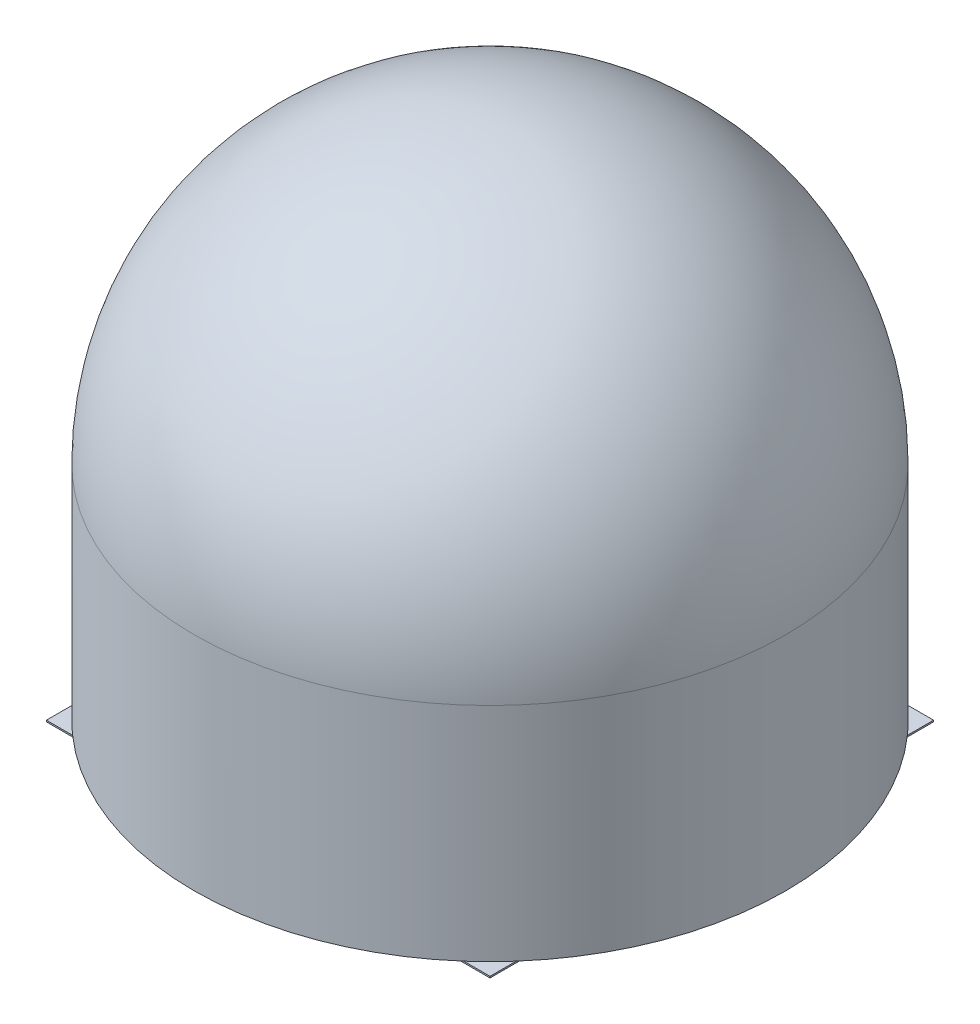
ISO-10303-21;
HEADER;
FILE_DESCRIPTION(('STEP AP214'),'2;1');
FILE_NAME('part.step','',(''),(''),'','','');
FILE_SCHEMA(('AUTOMOTIVE_DESIGN { 1 0 10303 214 1 1 1 1 }'));
ENDSEC;
DATA;
#1=APPLICATION_CONTEXT('core data for automotive mechanical design processes');
#2=APPLICATION_PROTOCOL_DEFINITION('international standard','automotive_design',2000,#1);
#3=PRODUCT_CONTEXT('',#1,'mechanical');
#4=PRODUCT('Part','Part','',(#3));
#5=PRODUCT_RELATED_PRODUCT_CATEGORY('part','',(#4));
#6=PRODUCT_DEFINITION_FORMATION('','',#4);
#7=PRODUCT_DEFINITION_CONTEXT('part definition',#1,'design');
#8=PRODUCT_DEFINITION('design','',#6,#7);
#9=PRODUCT_DEFINITION_SHAPE('','',#8);
#10=(LENGTH_UNIT() NAMED_UNIT(*) SI_UNIT(.MILLI.,.METRE.));
#11=(NAMED_UNIT(*) PLANE_ANGLE_UNIT() SI_UNIT($,.RADIAN.));
#12=(NAMED_UNIT(*) SI_UNIT($,.STERADIAN.) SOLID_ANGLE_UNIT());
#13=UNCERTAINTY_MEASURE_WITH_UNIT(LENGTH_MEASURE(1.E-05),#10,'distance_accuracy_value','');
#14=(GEOMETRIC_REPRESENTATION_CONTEXT(3) GLOBAL_UNCERTAINTY_ASSIGNED_CONTEXT((#13)) GLOBAL_UNIT_ASSIGNED_CONTEXT((#10,
#11,#12)) REPRESENTATION_CONTEXT('',''));
#15=CARTESIAN_POINT('',(0.,0.,0.));
#16=DIRECTION('',(0.,0.,1.));
#17=DIRECTION('',(1.,0.,0.));
#18=AXIS2_PLACEMENT_3D('',#15,#16,#17);
#19=CARTESIAN_POINT('',(0.,0.,0.));
#20=DIRECTION('',(0.,1.,0.));
#21=DIRECTION('',(0.,0.,1.));
#22=AXIS2_PLACEMENT_3D('',#19,#20,#21);
#23=PLANE('',#22);
#24=DIRECTION('',(0.,0.,1.));
#25=VECTOR('',#24,1.);
#26=CARTESIAN_POINT('',(150.,0.,150.));
#27=LINE('',#26,#25);
#28=CARTESIAN_POINT('',(150.,0.,-132.28756555323));
#29=VERTEX_POINT('',#28);
#30=CARTESIAN_POINT('',(150.,0.,132.28756555323));
#31=VERTEX_POINT('',#30);
#32=EDGE_CURVE('E11',#29,#31,#27,.T.);
#33=ORIENTED_EDGE('',*,*,#32,.F.);
#34=CARTESIAN_POINT('',(0.,0.,0.));
#35=DIRECTION('',(0.,1.,0.));
#36=DIRECTION('',(0.,0.,1.));
#37=AXIS2_PLACEMENT_3D('',#34,#35,#36);
#38=CIRCLE('',#37,200.);
#39=EDGE_CURVE('E148',#31,#29,#38,.T.);
#40=ORIENTED_EDGE('',*,*,#39,.F.);
#41=EDGE_LOOP('',(#33,#40));
#42=FACE_BOUND('',#41,.T.);
#43=ADVANCED_FACE('F39',(#42),#23,.F.);
#44=DIRECTION('',(1.,0.,0.));
#45=VECTOR('',#44,1.);
#46=CARTESIAN_POINT('',(-150.,0.,-150.));
#47=LINE('',#46,#45);
#48=CARTESIAN_POINT('',(-132.28756555323,0.,-150.));
#49=VERTEX_POINT('',#48);
#50=CARTESIAN_POINT('',(132.28756555323,0.,-150.));
#51=VERTEX_POINT('',#50);
#52=EDGE_CURVE('E49',#49,#51,#47,.T.);
#53=ORIENTED_EDGE('',*,*,#52,.F.);
#54=EDGE_CURVE('E160',#51,#49,#38,.T.);
#55=ORIENTED_EDGE('',*,*,#54,.F.);
#56=EDGE_LOOP('',(#53,#55));
#57=FACE_BOUND('',#56,.T.);
#58=ADVANCED_FACE('F223',(#57),#23,.F.);
#59=DIRECTION('',(0.,0.,-1.));
#60=VECTOR('',#59,1.);
#61=CARTESIAN_POINT('',(-150.,0.,150.));
#62=LINE('',#61,#60);
#63=CARTESIAN_POINT('',(-150.,0.,132.28756555323));
#64=VERTEX_POINT('',#63);
#65=CARTESIAN_POINT('',(-150.,0.,-132.28756555323));
#66=VERTEX_POINT('',#65);
#67=EDGE_CURVE('E58',#64,#66,#62,.T.);
#68=ORIENTED_EDGE('',*,*,#67,.F.);
#69=EDGE_CURVE('E61',#66,#64,#38,.T.);
#70=ORIENTED_EDGE('',*,*,#69,.F.);
#71=EDGE_LOOP('',(#68,#70));
#72=FACE_BOUND('',#71,.T.);
#73=ADVANCED_FACE('F225',(#72),#23,.F.);
#74=DIRECTION('',(-1.,0.,0.));
#75=VECTOR('',#74,1.);
#76=CARTESIAN_POINT('',(-150.,0.,150.));
#77=LINE('',#76,#75);
#78=CARTESIAN_POINT('',(132.28756555323,0.,150.));
#79=VERTEX_POINT('',#78);
#80=CARTESIAN_POINT('',(-132.287565553229,0.,150.));
#81=VERTEX_POINT('',#80);
#82=EDGE_CURVE('E155',#79,#81,#77,.T.);
#83=ORIENTED_EDGE('',*,*,#82,.F.);
#84=EDGE_CURVE('E136',#81,#79,#38,.T.);
#85=ORIENTED_EDGE('',*,*,#84,.F.);
#86=EDGE_LOOP('',(#83,#85));
#87=FACE_BOUND('',#86,.T.);
#88=ADVANCED_FACE('F178',(#87),#23,.F.);
#89=CARTESIAN_POINT('',(0.,150.,0.));
#90=DIRECTION('',(0.,-1.,0.));
#91=DIRECTION('',(0.,0.,-1.));
#92=AXIS2_PLACEMENT_3D('',#89,#90,#91);
#93=CYLINDRICAL_SURFACE('',#92,200.);
#94=CARTESIAN_POINT('',(0.,150.,0.));
#95=DIRECTION('',(0.,1.,0.));
#96=DIRECTION('',(0.,0.,1.));
#97=AXIS2_PLACEMENT_3D('',#94,#95,#96);
#98=CIRCLE('',#97,200.);
#99=CARTESIAN_POINT('',(0.,150.,200.));
#100=VERTEX_POINT('',#99);
#101=EDGE_CURVE('E43',#100,#100,#98,.T.);
#102=ORIENTED_EDGE('',*,*,#101,.F.);
#103=EDGE_LOOP('',(#102));
#104=FACE_BOUND('',#103,.T.);
#105=EDGE_CURVE('E142',#79,#31,#38,.T.);
#106=ORIENTED_EDGE('',*,*,#105,.T.);
#107=ORIENTED_EDGE('',*,*,#39,.T.);
#108=EDGE_CURVE('E156',#29,#51,#38,.T.);
#109=ORIENTED_EDGE('',*,*,#108,.T.);
#110=ORIENTED_EDGE('',*,*,#54,.T.);
#111=EDGE_CURVE('E164',#49,#66,#38,.T.);
#112=ORIENTED_EDGE('',*,*,#111,.T.);
#113=ORIENTED_EDGE('',*,*,#69,.T.);
#114=EDGE_CURVE('E141',#64,#81,#38,.T.);
#115=ORIENTED_EDGE('',*,*,#114,.T.);
#116=ORIENTED_EDGE('',*,*,#84,.T.);
#117=EDGE_LOOP('',(#106,#107,#109,#110,#112,#113,#115,#116));
#118=FACE_BOUND('',#117,.T.);
#119=ADVANCED_FACE('F172',(#104,#118),#93,.T.);
#120=CARTESIAN_POINT('',(0.,150.,0.));
#121=DIRECTION('',(0.,0.,1.));
#122=DIRECTION('',(1.,0.,0.));
#123=AXIS2_PLACEMENT_3D('',#120,#121,#122);
#124=SPHERICAL_SURFACE('',#123,200.);
#125=CARTESIAN_POINT('',(0.,150.,0.));
#126=DIRECTION('',(0.,1.,0.));
#127=DIRECTION('',(0.,0.,1.));
#128=AXIS2_PLACEMENT_3D('',#125,#126,#127);
#129=SPHERICAL_SURFACE('',#128,200.);
#130=ORIENTED_EDGE('',*,*,#101,.T.);
#131=EDGE_LOOP('',(#130));
#132=FACE_BOUND('',#131,.T.);
#133=ADVANCED_FACE('F41',(#132),#129,.T.);
#134=CARTESIAN_POINT('',(0.,0.,0.));
#135=DIRECTION('',(0.,-1.,0.));
#136=DIRECTION('',(0.,0.,-1.));
#137=AXIS2_PLACEMENT_3D('',#134,#135,#136);
#138=PLANE('',#137);
#139=ORIENTED_EDGE('',*,*,#105,.F.);
#140=CARTESIAN_POINT('',(150.,0.,150.));
#141=VERTEX_POINT('',#140);
#142=EDGE_CURVE('E184',#141,#79,#77,.T.);
#143=ORIENTED_EDGE('',*,*,#142,.F.);
#144=EDGE_CURVE('E52',#31,#141,#27,.T.);
#145=ORIENTED_EDGE('',*,*,#144,.F.);
#146=EDGE_LOOP('',(#139,#143,#145));
#147=FACE_BOUND('',#146,.T.);
#148=ADVANCED_FACE('F240',(#147),#138,.F.);
#149=ORIENTED_EDGE('',*,*,#108,.F.);
#150=CARTESIAN_POINT('',(150.,0.,-150.));
#151=VERTEX_POINT('',#150);
#152=EDGE_CURVE('E51',#151,#29,#27,.T.);
#153=ORIENTED_EDGE('',*,*,#152,.F.);
#154=EDGE_CURVE('E196',#51,#151,#47,.T.);
#155=ORIENTED_EDGE('',*,*,#154,.F.);
#156=EDGE_LOOP('',(#149,#153,#155));
#157=FACE_BOUND('',#156,.T.);
#158=ADVANCED_FACE('F219',(#157),#138,.F.);
#159=ORIENTED_EDGE('',*,*,#111,.F.);
#160=CARTESIAN_POINT('',(-150.,0.,-150.));
#161=VERTEX_POINT('',#160);
#162=EDGE_CURVE('E129',#161,#49,#47,.T.);
#163=ORIENTED_EDGE('',*,*,#162,.F.);
#164=EDGE_CURVE('E189',#66,#161,#62,.T.);
#165=ORIENTED_EDGE('',*,*,#164,.F.);
#166=EDGE_LOOP('',(#159,#163,#165));
#167=FACE_BOUND('',#166,.T.);
#168=ADVANCED_FACE('F209',(#167),#138,.F.);
#169=CARTESIAN_POINT('',(150.,-1.,150.));
#170=DIRECTION('',(-1.,0.,0.));
#171=DIRECTION('',(0.,0.,1.));
#172=AXIS2_PLACEMENT_3D('',#169,#170,#171);
#173=PLANE('',#172);
#174=ORIENTED_EDGE('',*,*,#152,.T.);
#175=ORIENTED_EDGE('',*,*,#32,.T.);
#176=ORIENTED_EDGE('',*,*,#144,.T.);
#177=DIRECTION('',(0.,1.,0.));
#178=VECTOR('',#177,1.);
#179=CARTESIAN_POINT('',(150.,-1.,150.));
#180=LINE('',#179,#178);
#181=CARTESIAN_POINT('',(150.,-1.,150.));
#182=VERTEX_POINT('',#181);
#183=EDGE_CURVE('E112',#182,#141,#180,.T.);
#184=ORIENTED_EDGE('',*,*,#183,.F.);
#185=DIRECTION('',(0.,0.,1.));
#186=VECTOR('',#185,1.);
#187=CARTESIAN_POINT('',(150.,-1.,150.));
#188=LINE('',#187,#186);
#189=CARTESIAN_POINT('',(150.,-1.,-150.));
#190=VERTEX_POINT('',#189);
#191=EDGE_CURVE('E119',#190,#182,#188,.T.);
#192=ORIENTED_EDGE('',*,*,#191,.F.);
#193=DIRECTION('',(0.,1.,0.));
#194=VECTOR('',#193,1.);
#195=CARTESIAN_POINT('',(150.,-1.,-150.));
#196=LINE('',#195,#194);
#197=EDGE_CURVE('E201',#190,#151,#196,.T.);
#198=ORIENTED_EDGE('',*,*,#197,.T.);
#199=EDGE_LOOP('',(#174,#175,#176,#184,#192,#198));
#200=FACE_BOUND('',#199,.T.);
#201=ADVANCED_FACE('F132',(#200),#173,.F.);
#202=CARTESIAN_POINT('',(-150.,-1.,150.));
#203=DIRECTION('',(0.,0.,-1.));
#204=DIRECTION('',(-1.,0.,0.));
#205=AXIS2_PLACEMENT_3D('',#202,#203,#204);
#206=PLANE('',#205);
#207=ORIENTED_EDGE('',*,*,#142,.T.);
#208=ORIENTED_EDGE('',*,*,#82,.T.);
#209=CARTESIAN_POINT('',(-150.,0.,150.));
#210=VERTEX_POINT('',#209);
#211=EDGE_CURVE('E180',#81,#210,#77,.T.);
#212=ORIENTED_EDGE('',*,*,#211,.T.);
#213=DIRECTION('',(0.,1.,0.));
#214=VECTOR('',#213,1.);
#215=CARTESIAN_POINT('',(-150.,-1.,150.));
#216=LINE('',#215,#214);
#217=CARTESIAN_POINT('',(-150.,-1.,150.));
#218=VERTEX_POINT('',#217);
#219=EDGE_CURVE('E114',#218,#210,#216,.T.);
#220=ORIENTED_EDGE('',*,*,#219,.F.);
#221=DIRECTION('',(-1.,0.,0.));
#222=VECTOR('',#221,1.);
#223=CARTESIAN_POINT('',(-150.,-1.,150.));
#224=LINE('',#223,#222);
#225=EDGE_CURVE('E107',#182,#218,#224,.T.);
#226=ORIENTED_EDGE('',*,*,#225,.F.);
#227=ORIENTED_EDGE('',*,*,#183,.T.);
#228=EDGE_LOOP('',(#207,#208,#212,#220,#226,#227));
#229=FACE_BOUND('',#228,.T.);
#230=ADVANCED_FACE('F110',(#229),#206,.F.);
#231=CARTESIAN_POINT('',(-150.,-1.,150.));
#232=DIRECTION('',(1.,0.,0.));
#233=DIRECTION('',(0.,0.,-1.));
#234=AXIS2_PLACEMENT_3D('',#231,#232,#233);
#235=PLANE('',#234);
#236=EDGE_CURVE('E182',#210,#64,#62,.T.);
#237=ORIENTED_EDGE('',*,*,#236,.T.);
#238=ORIENTED_EDGE('',*,*,#67,.T.);
#239=ORIENTED_EDGE('',*,*,#164,.T.);
#240=DIRECTION('',(0.,1.,0.));
#241=VECTOR('',#240,1.);
#242=CARTESIAN_POINT('',(-150.,-1.,-150.));
#243=LINE('',#242,#241);
#244=CARTESIAN_POINT('',(-150.,-1.,-150.));
#245=VERTEX_POINT('',#244);
#246=EDGE_CURVE('E143',#245,#161,#243,.T.);
#247=ORIENTED_EDGE('',*,*,#246,.F.);
#248=DIRECTION('',(0.,0.,-1.));
#249=VECTOR('',#248,1.);
#250=CARTESIAN_POINT('',(-150.,-1.,150.));
#251=LINE('',#250,#249);
#252=EDGE_CURVE('E118',#218,#245,#251,.T.);
#253=ORIENTED_EDGE('',*,*,#252,.F.);
#254=ORIENTED_EDGE('',*,*,#219,.T.);
#255=EDGE_LOOP('',(#237,#238,#239,#247,#253,#254));
#256=FACE_BOUND('',#255,.T.);
#257=ADVANCED_FACE('F210',(#256),#235,.F.);
#258=CARTESIAN_POINT('',(-150.,-1.,-150.));
#259=DIRECTION('',(0.,0.,1.));
#260=DIRECTION('',(1.,0.,0.));
#261=AXIS2_PLACEMENT_3D('',#258,#259,#260);
#262=PLANE('',#261);
#263=ORIENTED_EDGE('',*,*,#162,.T.);
#264=ORIENTED_EDGE('',*,*,#52,.T.);
#265=ORIENTED_EDGE('',*,*,#154,.T.);
#266=ORIENTED_EDGE('',*,*,#197,.F.);
#267=DIRECTION('',(1.,0.,0.));
#268=VECTOR('',#267,1.);
#269=CARTESIAN_POINT('',(-150.,-1.,-150.));
#270=LINE('',#269,#268);
#271=EDGE_CURVE('E124',#245,#190,#270,.T.);
#272=ORIENTED_EDGE('',*,*,#271,.F.);
#273=ORIENTED_EDGE('',*,*,#246,.T.);
#274=EDGE_LOOP('',(#263,#264,#265,#266,#272,#273));
#275=FACE_BOUND('',#274,.T.);
#276=ADVANCED_FACE('F206',(#275),#262,.F.);
#277=CARTESIAN_POINT('',(0.,-1.,0.));
#278=DIRECTION('',(0.,-1.,0.));
#279=DIRECTION('',(0.,0.,-1.));
#280=AXIS2_PLACEMENT_3D('',#277,#278,#279);
#281=PLANE('',#280);
#282=ORIENTED_EDGE('',*,*,#191,.T.);
#283=ORIENTED_EDGE('',*,*,#225,.T.);
#284=ORIENTED_EDGE('',*,*,#252,.T.);
#285=ORIENTED_EDGE('',*,*,#271,.T.);
#286=EDGE_LOOP('',(#282,#283,#284,#285));
#287=FACE_BOUND('',#286,.T.);
#288=ADVANCED_FACE('F122',(#287),#281,.T.);
#289=ORIENTED_EDGE('',*,*,#114,.F.);
#290=ORIENTED_EDGE('',*,*,#236,.F.);
#291=ORIENTED_EDGE('',*,*,#211,.F.);
#292=EDGE_LOOP('',(#289,#290,#291));
#293=FACE_BOUND('',#292,.T.);
#294=ADVANCED_FACE('F181',(#293),#138,.F.);
#295=CLOSED_SHELL('',(#43,#58,#73,#88,#119,#133,#148,#158,#168,#201,#230,#257,#276,#288,#294));
#296=MANIFOLD_SOLID_BREP('B2',#295);
#297=ADVANCED_BREP_SHAPE_REPRESENTATION('',(#18,#296),#14);
#298=SHAPE_DEFINITION_REPRESENTATION(#9,#297);
ENDSEC;
END-ISO-10303-21;
